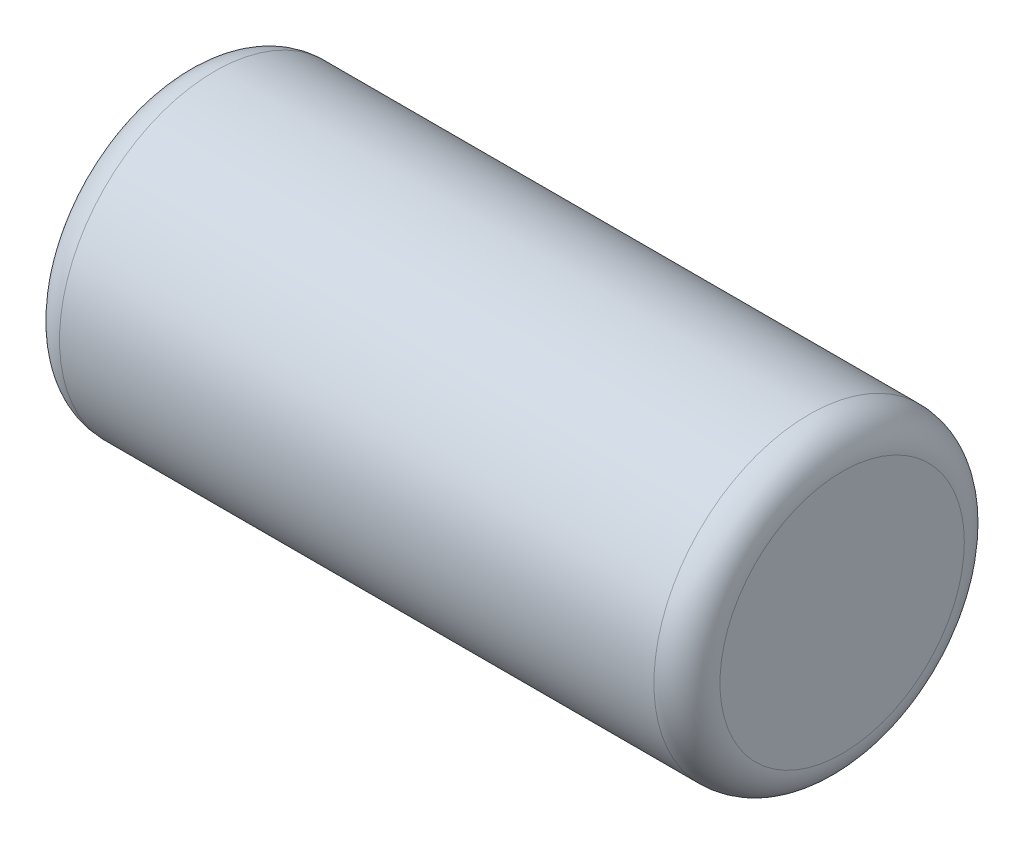
ISO-10303-21;
HEADER;
FILE_DESCRIPTION(('STEP AP214'),'2;1');
FILE_NAME('part.step','',(''),(''),'','','');
FILE_SCHEMA(('AUTOMOTIVE_DESIGN { 1 0 10303 214 1 1 1 1 }'));
ENDSEC;
DATA;
#1=APPLICATION_CONTEXT('core data for automotive mechanical design processes');
#2=APPLICATION_PROTOCOL_DEFINITION('international standard','automotive_design',2000,#1);
#3=PRODUCT_CONTEXT('',#1,'mechanical');
#4=PRODUCT('Part','Part','',(#3));
#5=PRODUCT_RELATED_PRODUCT_CATEGORY('part','',(#4));
#6=PRODUCT_DEFINITION_FORMATION('','',#4);
#7=PRODUCT_DEFINITION_CONTEXT('part definition',#1,'design');
#8=PRODUCT_DEFINITION('design','',#6,#7);
#9=PRODUCT_DEFINITION_SHAPE('','',#8);
#10=(LENGTH_UNIT() NAMED_UNIT(*) SI_UNIT(.MILLI.,.METRE.));
#11=(NAMED_UNIT(*) PLANE_ANGLE_UNIT() SI_UNIT($,.RADIAN.));
#12=(NAMED_UNIT(*) SI_UNIT($,.STERADIAN.) SOLID_ANGLE_UNIT());
#13=UNCERTAINTY_MEASURE_WITH_UNIT(LENGTH_MEASURE(1.E-05),#10,'distance_accuracy_value','');
#14=(GEOMETRIC_REPRESENTATION_CONTEXT(3) GLOBAL_UNCERTAINTY_ASSIGNED_CONTEXT((#13)) GLOBAL_UNIT_ASSIGNED_CONTEXT((#10,
#11,#12)) REPRESENTATION_CONTEXT('',''));
#15=CARTESIAN_POINT('',(0.,0.,0.));
#16=DIRECTION('',(0.,0.,1.));
#17=DIRECTION('',(1.,0.,0.));
#18=AXIS2_PLACEMENT_3D('',#15,#16,#17);
#19=CARTESIAN_POINT('',(10.,0.,0.));
#20=DIRECTION('',(-1.,0.,0.));
#21=DIRECTION('',(0.,0.,1.));
#22=AXIS2_PLACEMENT_3D('',#19,#20,#21);
#23=CYLINDRICAL_SURFACE('',#22,2.35);
#24=CARTESIAN_POINT('',(0.5,0.,0.));
#25=DIRECTION('',(1.,0.,0.));
#26=DIRECTION('',(0.,0.,-1.));
#27=AXIS2_PLACEMENT_3D('',#24,#25,#26);
#28=CIRCLE('',#27,2.35);
#29=CARTESIAN_POINT('',(0.5,0.,-2.35));
#30=VERTEX_POINT('',#29);
#31=EDGE_CURVE('E56',#30,#30,#28,.T.);
#32=ORIENTED_EDGE('',*,*,#31,.T.);
#33=EDGE_LOOP('',(#32));
#34=FACE_BOUND('',#33,.T.);
#35=CARTESIAN_POINT('',(9.5,0.,0.));
#36=DIRECTION('',(1.,0.,0.));
#37=DIRECTION('',(0.,0.,-1.));
#38=AXIS2_PLACEMENT_3D('',#35,#36,#37);
#39=CIRCLE('',#38,2.35);
#40=CARTESIAN_POINT('',(9.5,0.,-2.35));
#41=VERTEX_POINT('',#40);
#42=EDGE_CURVE('E61',#41,#41,#39,.F.);
#43=ORIENTED_EDGE('',*,*,#42,.T.);
#44=EDGE_LOOP('',(#43));
#45=FACE_BOUND('',#44,.T.);
#46=ADVANCED_FACE('F43',(#34,#45),#23,.T.);
#47=CARTESIAN_POINT('',(10.,0.,0.));
#48=DIRECTION('',(1.,0.,0.));
#49=DIRECTION('',(0.,0.,-1.));
#50=AXIS2_PLACEMENT_3D('',#47,#48,#49);
#51=PLANE('',#50);
#52=CARTESIAN_POINT('',(10.,0.,0.));
#53=DIRECTION('',(1.,0.,0.));
#54=DIRECTION('',(0.,0.,-1.));
#55=AXIS2_PLACEMENT_3D('',#52,#53,#54);
#56=CIRCLE('',#55,1.85);
#57=CARTESIAN_POINT('',(10.,0.,-1.85));
#58=VERTEX_POINT('',#57);
#59=EDGE_CURVE('E10',#58,#58,#56,.T.);
#60=ORIENTED_EDGE('',*,*,#59,.T.);
#61=EDGE_LOOP('',(#60));
#62=FACE_BOUND('',#61,.T.);
#63=ADVANCED_FACE('F78',(#62),#51,.T.);
#64=CARTESIAN_POINT('',(0.,0.,0.));
#65=DIRECTION('',(1.,0.,0.));
#66=DIRECTION('',(0.,0.,-1.));
#67=AXIS2_PLACEMENT_3D('',#64,#65,#66);
#68=PLANE('',#67);
#69=CARTESIAN_POINT('',(0.,0.,0.));
#70=DIRECTION('',(1.,0.,0.));
#71=DIRECTION('',(0.,0.,-1.));
#72=AXIS2_PLACEMENT_3D('',#69,#70,#71);
#73=CIRCLE('',#72,1.85);
#74=CARTESIAN_POINT('',(0.,0.,-1.85));
#75=VERTEX_POINT('',#74);
#76=EDGE_CURVE('E51',#75,#75,#73,.F.);
#77=ORIENTED_EDGE('',*,*,#76,.T.);
#78=EDGE_LOOP('',(#77));
#79=FACE_BOUND('',#78,.T.);
#80=ADVANCED_FACE('F75',(#79),#68,.F.);
#81=CARTESIAN_POINT('',(0.5,0.,0.));
#82=DIRECTION('',(1.,0.,0.));
#83=DIRECTION('',(0.,0.,-1.));
#84=AXIS2_PLACEMENT_3D('',#81,#82,#83);
#85=TOROIDAL_SURFACE('',#84,1.85,0.5);
#86=ORIENTED_EDGE('',*,*,#76,.F.);
#87=EDGE_LOOP('',(#86));
#88=FACE_BOUND('',#87,.T.);
#89=ORIENTED_EDGE('',*,*,#31,.F.);
#90=EDGE_LOOP('',(#89));
#91=FACE_BOUND('',#90,.T.);
#92=ADVANCED_FACE('F71',(#88,#91),#85,.T.);
#93=CARTESIAN_POINT('',(9.5,0.,0.));
#94=DIRECTION('',(1.,0.,0.));
#95=DIRECTION('',(0.,0.,-1.));
#96=AXIS2_PLACEMENT_3D('',#93,#94,#95);
#97=TOROIDAL_SURFACE('',#96,1.85,0.5);
#98=ORIENTED_EDGE('',*,*,#42,.F.);
#99=EDGE_LOOP('',(#98));
#100=FACE_BOUND('',#99,.T.);
#101=ORIENTED_EDGE('',*,*,#59,.F.);
#102=EDGE_LOOP('',(#101));
#103=FACE_BOUND('',#102,.T.);
#104=ADVANCED_FACE('F45',(#100,#103),#97,.T.);
#105=CLOSED_SHELL('',(#46,#63,#80,#92,#104));
#106=MANIFOLD_SOLID_BREP('B2',#105);
#107=ADVANCED_BREP_SHAPE_REPRESENTATION('',(#18,#106),#14);
#108=SHAPE_DEFINITION_REPRESENTATION(#9,#107);
ENDSEC;
END-ISO-10303-21;
